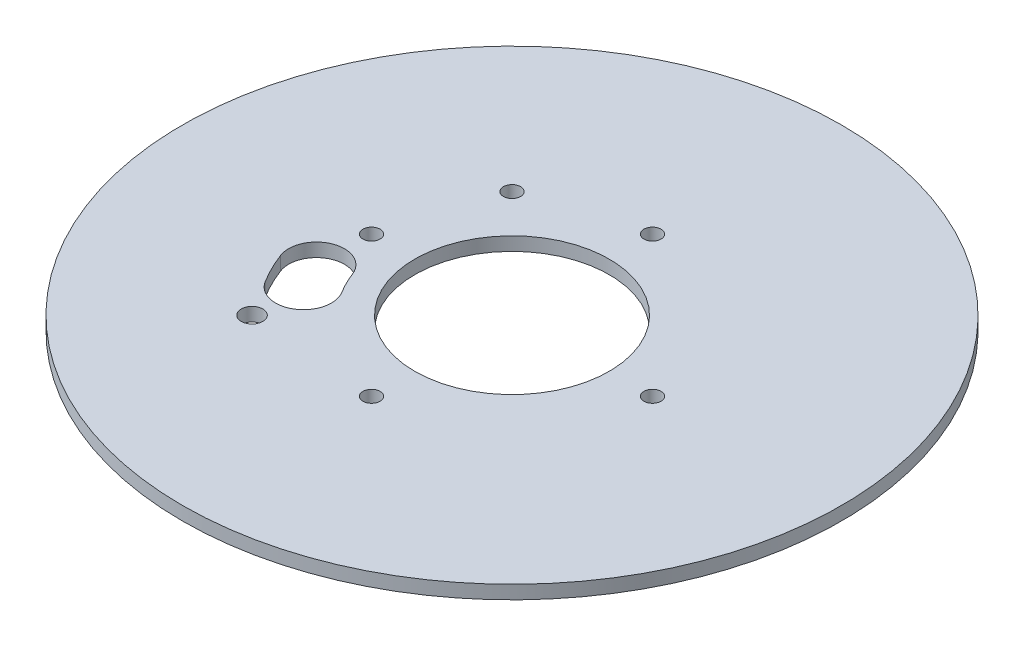
ISO-10303-21;
HEADER;
FILE_DESCRIPTION(('STEP AP214'),'2;1');
FILE_NAME('part.step','',(''),(''),'','','');
FILE_SCHEMA(('AUTOMOTIVE_DESIGN { 1 0 10303 214 1 1 1 1 }'));
ENDSEC;
DATA;
#1=APPLICATION_CONTEXT('core data for automotive mechanical design processes');
#2=APPLICATION_PROTOCOL_DEFINITION('international standard','automotive_design',2000,#1);
#3=PRODUCT_CONTEXT('',#1,'mechanical');
#4=PRODUCT('Part','Part','',(#3));
#5=PRODUCT_RELATED_PRODUCT_CATEGORY('part','',(#4));
#6=PRODUCT_DEFINITION_FORMATION('','',#4);
#7=PRODUCT_DEFINITION_CONTEXT('part definition',#1,'design');
#8=PRODUCT_DEFINITION('design','',#6,#7);
#9=PRODUCT_DEFINITION_SHAPE('','',#8);
#10=(LENGTH_UNIT() NAMED_UNIT(*) SI_UNIT(.MILLI.,.METRE.));
#11=(NAMED_UNIT(*) PLANE_ANGLE_UNIT() SI_UNIT($,.RADIAN.));
#12=(NAMED_UNIT(*) SI_UNIT($,.STERADIAN.) SOLID_ANGLE_UNIT());
#13=UNCERTAINTY_MEASURE_WITH_UNIT(LENGTH_MEASURE(1.E-05),#10,'distance_accuracy_value','');
#14=(GEOMETRIC_REPRESENTATION_CONTEXT(3) GLOBAL_UNCERTAINTY_ASSIGNED_CONTEXT((#13)) GLOBAL_UNIT_ASSIGNED_CONTEXT((#10,
#11,#12)) REPRESENTATION_CONTEXT('',''));
#15=CARTESIAN_POINT('',(0.,0.,0.));
#16=DIRECTION('',(0.,0.,1.));
#17=DIRECTION('',(1.,0.,0.));
#18=AXIS2_PLACEMENT_3D('',#15,#16,#17);
#19=CARTESIAN_POINT('',(0.,3.175,0.));
#20=DIRECTION('',(0.,-1.,0.));
#21=DIRECTION('',(0.,0.,-1.));
#22=AXIS2_PLACEMENT_3D('',#19,#20,#21);
#23=CYLINDRICAL_SURFACE('',#22,77.4600051);
#24=CARTESIAN_POINT('',(0.,3.175,0.));
#25=DIRECTION('',(0.,1.,0.));
#26=DIRECTION('',(0.,0.,1.));
#27=AXIS2_PLACEMENT_3D('',#24,#25,#26);
#28=CIRCLE('',#27,77.4600051);
#29=CARTESIAN_POINT('',(0.,3.175,77.4600051));
#30=VERTEX_POINT('',#29);
#31=EDGE_CURVE('E11',#30,#30,#28,.T.);
#32=ORIENTED_EDGE('',*,*,#31,.F.);
#33=EDGE_LOOP('',(#32));
#34=FACE_BOUND('',#33,.T.);
#35=CARTESIAN_POINT('',(0.,0.,0.));
#36=DIRECTION('',(0.,1.,0.));
#37=DIRECTION('',(0.,0.,1.));
#38=AXIS2_PLACEMENT_3D('',#35,#36,#37);
#39=CIRCLE('',#38,77.4600051);
#40=CARTESIAN_POINT('',(0.,0.,77.4600051));
#41=VERTEX_POINT('',#40);
#42=EDGE_CURVE('E36',#41,#41,#39,.T.);
#43=ORIENTED_EDGE('',*,*,#42,.T.);
#44=EDGE_LOOP('',(#43));
#45=FACE_BOUND('',#44,.T.);
#46=ADVANCED_FACE('F33',(#34,#45),#23,.T.);
#47=CARTESIAN_POINT('',(0.,3.175,0.));
#48=DIRECTION('',(0.,1.,0.));
#49=DIRECTION('',(0.,0.,1.));
#50=AXIS2_PLACEMENT_3D('',#47,#48,#49);
#51=PLANE('',#50);
#52=CARTESIAN_POINT('',(-30.5519464266559,3.175,30.5519464266555));
#53=DIRECTION('',(0.,-1.,0.));
#54=DIRECTION('',(0.,0.,-1.));
#55=AXIS2_PLACEMENT_3D('',#52,#53,#54);
#56=CIRCLE('',#55,2.53999999999999);
#57=CARTESIAN_POINT('',(-30.5519464266559,3.175,28.0119464266556));
#58=VERTEX_POINT('',#57);
#59=EDGE_CURVE('E92',#58,#58,#56,.T.);
#60=ORIENTED_EDGE('',*,*,#59,.T.);
#61=EDGE_LOOP('',(#60));
#62=FACE_BOUND('',#61,.T.);
#63=CARTESIAN_POINT('',(-33.242514605961,3.175,12.7030765646133));
#64=DIRECTION('',(0.,1.,0.));
#65=DIRECTION('',(0.,0.,1.));
#66=AXIS2_PLACEMENT_3D('',#63,#64,#65);
#67=CIRCLE('',#66,6.55197639919967);
#68=CARTESIAN_POINT('',(-27.1221810022313,3.175,10.3642924115272));
#69=VERTEX_POINT('',#68);
#70=CARTESIAN_POINT('',(-39.3628482096907,3.175,15.0418607176993));
#71=VERTEX_POINT('',#70);
#72=EDGE_CURVE('E79',#69,#71,#67,.T.);
#73=ORIENTED_EDGE('',*,*,#72,.F.);
#74=CARTESIAN_POINT('',(0.,3.175,0.));
#75=DIRECTION('',(0.,1.,0.));
#76=DIRECTION('',(0.,0.,1.));
#77=AXIS2_PLACEMENT_3D('',#74,#75,#76);
#78=CIRCLE('',#77,29.0350005942731);
#79=CARTESIAN_POINT('',(-24.6777747972826,3.175,15.2983231291551));
#80=VERTEX_POINT('',#79);
#81=EDGE_CURVE('E111',#80,#69,#78,.F.);
#82=ORIENTED_EDGE('',*,*,#81,.F.);
#83=CARTESIAN_POINT('',(-30.2465089025766,3.175,18.7505101461351));
#84=DIRECTION('',(0.,1.,0.));
#85=DIRECTION('',(0.,0.,1.));
#86=AXIS2_PLACEMENT_3D('',#83,#84,#85);
#87=CIRCLE('',#86,6.55197639919968);
#88=CARTESIAN_POINT('',(-35.8152430078706,3.175,22.202697163115));
#89=VERTEX_POINT('',#88);
#90=EDGE_CURVE('E109',#89,#80,#87,.T.);
#91=ORIENTED_EDGE('',*,*,#90,.F.);
#92=CARTESIAN_POINT('',(0.,3.175,0.));
#93=DIRECTION('',(0.,1.,0.));
#94=DIRECTION('',(0.,0.,1.));
#95=AXIS2_PLACEMENT_3D('',#92,#93,#94);
#96=CIRCLE('',#95,42.1389533926724);
#97=EDGE_CURVE('E103',#71,#89,#96,.T.);
#98=ORIENTED_EDGE('',*,*,#97,.F.);
#99=EDGE_LOOP('',(#73,#82,#91,#98));
#100=FACE_BOUND('',#99,.T.);
#101=CARTESIAN_POINT('',(-25.1637927540144,3.175,-25.1637927540141));
#102=DIRECTION('',(0.,1.,0.));
#103=DIRECTION('',(0.,0.,1.));
#104=AXIS2_PLACEMENT_3D('',#101,#102,#103);
#105=CIRCLE('',#104,2.0193);
#106=CARTESIAN_POINT('',(-25.1637927540144,3.175,-23.1444927540141));
#107=VERTEX_POINT('',#106);
#108=EDGE_CURVE('E117',#107,#107,#105,.T.);
#109=ORIENTED_EDGE('',*,*,#108,.F.);
#110=EDGE_LOOP('',(#109));
#111=FACE_BOUND('',#110,.T.);
#112=CARTESIAN_POINT('',(-33.0199999999991,3.175,5.68989300120393E-13));
#113=DIRECTION('',(0.,1.,0.));
#114=DIRECTION('',(0.,0.,1.));
#115=AXIS2_PLACEMENT_3D('',#112,#113,#114);
#116=CIRCLE('',#115,2.0193);
#117=CARTESIAN_POINT('',(-33.0199999999991,3.175,2.01930000000057));
#118=VERTEX_POINT('',#117);
#119=EDGE_CURVE('E123',#118,#118,#116,.T.);
#120=ORIENTED_EDGE('',*,*,#119,.F.);
#121=EDGE_LOOP('',(#120));
#122=FACE_BOUND('',#121,.T.);
#123=CARTESIAN_POINT('',(1.63757896132211E-12,3.175,33.02));
#124=DIRECTION('',(0.,1.,0.));
#125=DIRECTION('',(0.,0.,1.));
#126=AXIS2_PLACEMENT_3D('',#123,#124,#125);
#127=CIRCLE('',#126,2.0193);
#128=CARTESIAN_POINT('',(1.63757896132211E-12,3.175,35.0393));
#129=VERTEX_POINT('',#128);
#130=EDGE_CURVE('E129',#129,#129,#127,.T.);
#131=ORIENTED_EDGE('',*,*,#130,.F.);
#132=EDGE_LOOP('',(#131));
#133=FACE_BOUND('',#132,.T.);
#134=CARTESIAN_POINT('',(33.0200000000009,3.175,-8.32667268468867E-13));
#135=DIRECTION('',(0.,1.,0.));
#136=DIRECTION('',(0.,0.,1.));
#137=AXIS2_PLACEMENT_3D('',#134,#135,#136);
#138=CIRCLE('',#137,2.01930000000001);
#139=CARTESIAN_POINT('',(33.0200000000009,3.175,2.01929999999917));
#140=VERTEX_POINT('',#139);
#141=EDGE_CURVE('E135',#140,#140,#138,.T.);
#142=ORIENTED_EDGE('',*,*,#141,.F.);
#143=EDGE_LOOP('',(#142));
#144=FACE_BOUND('',#143,.T.);
#145=CARTESIAN_POINT('',(0.,3.175,-33.02));
#146=DIRECTION('',(0.,1.,0.));
#147=DIRECTION('',(0.,0.,1.));
#148=AXIS2_PLACEMENT_3D('',#145,#146,#147);
#149=CIRCLE('',#148,2.01930000000001);
#150=CARTESIAN_POINT('',(0.,3.175,-31.0007));
#151=VERTEX_POINT('',#150);
#152=EDGE_CURVE('E141',#151,#151,#149,.T.);
#153=ORIENTED_EDGE('',*,*,#152,.F.);
#154=EDGE_LOOP('',(#153));
#155=FACE_BOUND('',#154,.T.);
#156=CARTESIAN_POINT('',(0.,3.175,0.));
#157=DIRECTION('',(0.,1.,0.));
#158=DIRECTION('',(0.,0.,1.));
#159=AXIS2_PLACEMENT_3D('',#156,#157,#158);
#160=CIRCLE('',#159,22.86);
#161=CARTESIAN_POINT('',(0.,3.175,22.86));
#162=VERTEX_POINT('',#161);
#163=EDGE_CURVE('E147',#162,#162,#160,.T.);
#164=ORIENTED_EDGE('',*,*,#163,.F.);
#165=EDGE_LOOP('',(#164));
#166=FACE_BOUND('',#165,.T.);
#167=ORIENTED_EDGE('',*,*,#31,.T.);
#168=EDGE_LOOP('',(#167));
#169=FACE_BOUND('',#168,.T.);
#170=ADVANCED_FACE('F157',(#62,#100,#111,#122,#133,#144,#155,#166,#169),#51,.T.);
#171=CARTESIAN_POINT('',(0.,0.,0.));
#172=DIRECTION('',(0.,1.,0.));
#173=DIRECTION('',(0.,0.,1.));
#174=AXIS2_PLACEMENT_3D('',#171,#172,#173);
#175=PLANE('',#174);
#176=CARTESIAN_POINT('',(-30.5519464266559,0.,30.5519464266555));
#177=DIRECTION('',(0.,-1.,0.));
#178=DIRECTION('',(0.,0.,-1.));
#179=AXIS2_PLACEMENT_3D('',#176,#177,#178);
#180=CIRCLE('',#179,2.53999999999999);
#181=CARTESIAN_POINT('',(-30.5519464266559,0.,28.0119464266556));
#182=VERTEX_POINT('',#181);
#183=EDGE_CURVE('E95',#182,#182,#180,.T.);
#184=ORIENTED_EDGE('',*,*,#183,.F.);
#185=EDGE_LOOP('',(#184));
#186=FACE_BOUND('',#185,.T.);
#187=CARTESIAN_POINT('',(0.,0.,0.));
#188=DIRECTION('',(0.,-1.,0.));
#189=DIRECTION('',(0.,0.,1.));
#190=AXIS2_PLACEMENT_3D('',#187,#188,#189);
#191=CIRCLE('',#190,29.0350005942731);
#192=CARTESIAN_POINT('',(-24.6777747972826,0.,15.2983231291551));
#193=VERTEX_POINT('',#192);
#194=CARTESIAN_POINT('',(-27.1221810022313,0.,10.3642924115272));
#195=VERTEX_POINT('',#194);
#196=EDGE_CURVE('E82',#193,#195,#191,.T.);
#197=ORIENTED_EDGE('',*,*,#196,.T.);
#198=CARTESIAN_POINT('',(-33.242514605961,0.,12.7030765646133));
#199=DIRECTION('',(0.,1.,0.));
#200=DIRECTION('',(0.,0.,1.));
#201=AXIS2_PLACEMENT_3D('',#198,#199,#200);
#202=CIRCLE('',#201,6.55197639919967);
#203=CARTESIAN_POINT('',(-39.3628482096907,0.,15.0418607176993));
#204=VERTEX_POINT('',#203);
#205=EDGE_CURVE('E76',#195,#204,#202,.T.);
#206=ORIENTED_EDGE('',*,*,#205,.T.);
#207=CARTESIAN_POINT('',(0.,0.,0.));
#208=DIRECTION('',(0.,1.,0.));
#209=DIRECTION('',(0.,0.,1.));
#210=AXIS2_PLACEMENT_3D('',#207,#208,#209);
#211=CIRCLE('',#210,42.1389533926724);
#212=CARTESIAN_POINT('',(-35.8152430078706,0.,22.202697163115));
#213=VERTEX_POINT('',#212);
#214=EDGE_CURVE('E85',#204,#213,#211,.T.);
#215=ORIENTED_EDGE('',*,*,#214,.T.);
#216=CARTESIAN_POINT('',(-30.2465089025766,0.,18.7505101461351));
#217=DIRECTION('',(0.,1.,0.));
#218=DIRECTION('',(0.,0.,1.));
#219=AXIS2_PLACEMENT_3D('',#216,#217,#218);
#220=CIRCLE('',#219,6.55197639919968);
#221=EDGE_CURVE('E55',#213,#193,#220,.T.);
#222=ORIENTED_EDGE('',*,*,#221,.T.);
#223=EDGE_LOOP('',(#197,#206,#215,#222));
#224=FACE_BOUND('',#223,.T.);
#225=CARTESIAN_POINT('',(-25.1637927540144,0.,-25.1637927540141));
#226=DIRECTION('',(0.,1.,0.));
#227=DIRECTION('',(0.,0.,1.));
#228=AXIS2_PLACEMENT_3D('',#225,#226,#227);
#229=CIRCLE('',#228,2.0193);
#230=CARTESIAN_POINT('',(-25.1637927540144,0.,-23.1444927540141));
#231=VERTEX_POINT('',#230);
#232=EDGE_CURVE('E114',#231,#231,#229,.T.);
#233=ORIENTED_EDGE('',*,*,#232,.T.);
#234=EDGE_LOOP('',(#233));
#235=FACE_BOUND('',#234,.T.);
#236=CARTESIAN_POINT('',(-33.0199999999991,0.,5.68989300120393E-13));
#237=DIRECTION('',(0.,1.,0.));
#238=DIRECTION('',(0.,0.,1.));
#239=AXIS2_PLACEMENT_3D('',#236,#237,#238);
#240=CIRCLE('',#239,2.0193);
#241=CARTESIAN_POINT('',(-33.0199999999991,0.,2.01930000000057));
#242=VERTEX_POINT('',#241);
#243=EDGE_CURVE('E120',#242,#242,#240,.T.);
#244=ORIENTED_EDGE('',*,*,#243,.T.);
#245=EDGE_LOOP('',(#244));
#246=FACE_BOUND('',#245,.T.);
#247=CARTESIAN_POINT('',(1.63757896132211E-12,0.,33.02));
#248=DIRECTION('',(0.,1.,0.));
#249=DIRECTION('',(0.,0.,1.));
#250=AXIS2_PLACEMENT_3D('',#247,#248,#249);
#251=CIRCLE('',#250,2.0193);
#252=CARTESIAN_POINT('',(1.63757896132211E-12,0.,35.0393));
#253=VERTEX_POINT('',#252);
#254=EDGE_CURVE('E126',#253,#253,#251,.T.);
#255=ORIENTED_EDGE('',*,*,#254,.T.);
#256=EDGE_LOOP('',(#255));
#257=FACE_BOUND('',#256,.T.);
#258=CARTESIAN_POINT('',(33.0200000000009,0.,-8.32667268468867E-13));
#259=DIRECTION('',(0.,1.,0.));
#260=DIRECTION('',(0.,0.,1.));
#261=AXIS2_PLACEMENT_3D('',#258,#259,#260);
#262=CIRCLE('',#261,2.01930000000001);
#263=CARTESIAN_POINT('',(33.0200000000009,0.,2.01929999999917));
#264=VERTEX_POINT('',#263);
#265=EDGE_CURVE('E132',#264,#264,#262,.T.);
#266=ORIENTED_EDGE('',*,*,#265,.T.);
#267=EDGE_LOOP('',(#266));
#268=FACE_BOUND('',#267,.T.);
#269=CARTESIAN_POINT('',(0.,0.,-33.02));
#270=DIRECTION('',(0.,1.,0.));
#271=DIRECTION('',(0.,0.,1.));
#272=AXIS2_PLACEMENT_3D('',#269,#270,#271);
#273=CIRCLE('',#272,2.01930000000001);
#274=CARTESIAN_POINT('',(0.,0.,-31.0007));
#275=VERTEX_POINT('',#274);
#276=EDGE_CURVE('E138',#275,#275,#273,.T.);
#277=ORIENTED_EDGE('',*,*,#276,.T.);
#278=EDGE_LOOP('',(#277));
#279=FACE_BOUND('',#278,.T.);
#280=CARTESIAN_POINT('',(0.,0.,0.));
#281=DIRECTION('',(0.,1.,0.));
#282=DIRECTION('',(0.,0.,1.));
#283=AXIS2_PLACEMENT_3D('',#280,#281,#282);
#284=CIRCLE('',#283,22.86);
#285=CARTESIAN_POINT('',(0.,0.,22.86));
#286=VERTEX_POINT('',#285);
#287=EDGE_CURVE('E144',#286,#286,#284,.T.);
#288=ORIENTED_EDGE('',*,*,#287,.T.);
#289=EDGE_LOOP('',(#288));
#290=FACE_BOUND('',#289,.T.);
#291=ORIENTED_EDGE('',*,*,#42,.F.);
#292=EDGE_LOOP('',(#291));
#293=FACE_BOUND('',#292,.T.);
#294=ADVANCED_FACE('F89',(#186,#224,#235,#246,#257,#268,#279,#290,#293),#175,.F.);
#295=CARTESIAN_POINT('',(0.,0.,0.));
#296=DIRECTION('',(0.,1.,0.));
#297=DIRECTION('',(0.,0.,1.));
#298=AXIS2_PLACEMENT_3D('',#295,#296,#297);
#299=CYLINDRICAL_SURFACE('',#298,22.86);
#300=ORIENTED_EDGE('',*,*,#163,.T.);
#301=EDGE_LOOP('',(#300));
#302=FACE_BOUND('',#301,.T.);
#303=ORIENTED_EDGE('',*,*,#287,.F.);
#304=EDGE_LOOP('',(#303));
#305=FACE_BOUND('',#304,.T.);
#306=ADVANCED_FACE('F156',(#302,#305),#299,.F.);
#307=CARTESIAN_POINT('',(0.,0.,-33.02));
#308=DIRECTION('',(0.,1.,0.));
#309=DIRECTION('',(0.,0.,1.));
#310=AXIS2_PLACEMENT_3D('',#307,#308,#309);
#311=CYLINDRICAL_SURFACE('',#310,2.01930000000001);
#312=ORIENTED_EDGE('',*,*,#152,.T.);
#313=EDGE_LOOP('',(#312));
#314=FACE_BOUND('',#313,.T.);
#315=ORIENTED_EDGE('',*,*,#276,.F.);
#316=EDGE_LOOP('',(#315));
#317=FACE_BOUND('',#316,.T.);
#318=ADVANCED_FACE('F164',(#314,#317),#311,.F.);
#319=CARTESIAN_POINT('',(33.0200000000009,0.,-8.32667268468867E-13));
#320=DIRECTION('',(0.,1.,0.));
#321=DIRECTION('',(0.,0.,1.));
#322=AXIS2_PLACEMENT_3D('',#319,#320,#321);
#323=CYLINDRICAL_SURFACE('',#322,2.01930000000001);
#324=ORIENTED_EDGE('',*,*,#141,.T.);
#325=EDGE_LOOP('',(#324));
#326=FACE_BOUND('',#325,.T.);
#327=ORIENTED_EDGE('',*,*,#265,.F.);
#328=EDGE_LOOP('',(#327));
#329=FACE_BOUND('',#328,.T.);
#330=ADVANCED_FACE('F196',(#326,#329),#323,.F.);
#331=CARTESIAN_POINT('',(1.63757896132211E-12,0.,33.02));
#332=DIRECTION('',(0.,1.,0.));
#333=DIRECTION('',(0.,0.,1.));
#334=AXIS2_PLACEMENT_3D('',#331,#332,#333);
#335=CYLINDRICAL_SURFACE('',#334,2.0193);
#336=ORIENTED_EDGE('',*,*,#130,.T.);
#337=EDGE_LOOP('',(#336));
#338=FACE_BOUND('',#337,.T.);
#339=ORIENTED_EDGE('',*,*,#254,.F.);
#340=EDGE_LOOP('',(#339));
#341=FACE_BOUND('',#340,.T.);
#342=ADVANCED_FACE('F204',(#338,#341),#335,.F.);
#343=CARTESIAN_POINT('',(-33.0199999999991,0.,5.68989300120393E-13));
#344=DIRECTION('',(0.,1.,0.));
#345=DIRECTION('',(0.,0.,1.));
#346=AXIS2_PLACEMENT_3D('',#343,#344,#345);
#347=CYLINDRICAL_SURFACE('',#346,2.0193);
#348=ORIENTED_EDGE('',*,*,#119,.T.);
#349=EDGE_LOOP('',(#348));
#350=FACE_BOUND('',#349,.T.);
#351=ORIENTED_EDGE('',*,*,#243,.F.);
#352=EDGE_LOOP('',(#351));
#353=FACE_BOUND('',#352,.T.);
#354=ADVANCED_FACE('F212',(#350,#353),#347,.F.);
#355=CARTESIAN_POINT('',(-25.1637927540144,0.,-25.1637927540141));
#356=DIRECTION('',(0.,1.,0.));
#357=DIRECTION('',(0.,0.,1.));
#358=AXIS2_PLACEMENT_3D('',#355,#356,#357);
#359=CYLINDRICAL_SURFACE('',#358,2.0193);
#360=ORIENTED_EDGE('',*,*,#108,.T.);
#361=EDGE_LOOP('',(#360));
#362=FACE_BOUND('',#361,.T.);
#363=ORIENTED_EDGE('',*,*,#232,.F.);
#364=EDGE_LOOP('',(#363));
#365=FACE_BOUND('',#364,.T.);
#366=ADVANCED_FACE('F220',(#362,#365),#359,.F.);
#367=CARTESIAN_POINT('',(-33.242514605961,0.,12.7030765646133));
#368=DIRECTION('',(0.,1.,0.));
#369=DIRECTION('',(0.,0.,1.));
#370=AXIS2_PLACEMENT_3D('',#367,#368,#369);
#371=CYLINDRICAL_SURFACE('',#370,6.55197639919967);
#372=ORIENTED_EDGE('',*,*,#72,.T.);
#373=DIRECTION('',(0.,1.,0.));
#374=VECTOR('',#373,1.);
#375=CARTESIAN_POINT('',(-39.3628482096907,0.,15.0418607176993));
#376=LINE('',#375,#374);
#377=EDGE_CURVE('E47',#204,#71,#376,.T.);
#378=ORIENTED_EDGE('',*,*,#377,.F.);
#379=ORIENTED_EDGE('',*,*,#205,.F.);
#380=DIRECTION('',(0.,1.,0.));
#381=VECTOR('',#380,1.);
#382=CARTESIAN_POINT('',(-27.1221810022313,0.,10.3642924115272));
#383=LINE('',#382,#381);
#384=EDGE_CURVE('E101',#195,#69,#383,.T.);
#385=ORIENTED_EDGE('',*,*,#384,.T.);
#386=EDGE_LOOP('',(#372,#378,#379,#385));
#387=FACE_BOUND('',#386,.T.);
#388=ADVANCED_FACE('F73',(#387),#371,.F.);
#389=CARTESIAN_POINT('',(0.,0.,0.));
#390=DIRECTION('',(0.,1.,0.));
#391=DIRECTION('',(0.,0.,1.));
#392=AXIS2_PLACEMENT_3D('',#389,#390,#391);
#393=CYLINDRICAL_SURFACE('',#392,29.0350005942731);
#394=ORIENTED_EDGE('',*,*,#81,.T.);
#395=ORIENTED_EDGE('',*,*,#384,.F.);
#396=ORIENTED_EDGE('',*,*,#196,.F.);
#397=DIRECTION('',(0.,1.,0.));
#398=VECTOR('',#397,1.);
#399=CARTESIAN_POINT('',(-24.6777747972826,0.,15.2983231291551));
#400=LINE('',#399,#398);
#401=EDGE_CURVE('E104',#193,#80,#400,.T.);
#402=ORIENTED_EDGE('',*,*,#401,.T.);
#403=EDGE_LOOP('',(#394,#395,#396,#402));
#404=FACE_BOUND('',#403,.T.);
#405=ADVANCED_FACE('F235',(#404),#393,.T.);
#406=CARTESIAN_POINT('',(-30.2465089025766,0.,18.7505101461351));
#407=DIRECTION('',(0.,1.,0.));
#408=DIRECTION('',(0.,0.,1.));
#409=AXIS2_PLACEMENT_3D('',#406,#407,#408);
#410=CYLINDRICAL_SURFACE('',#409,6.55197639919968);
#411=ORIENTED_EDGE('',*,*,#90,.T.);
#412=ORIENTED_EDGE('',*,*,#401,.F.);
#413=ORIENTED_EDGE('',*,*,#221,.F.);
#414=DIRECTION('',(0.,1.,0.));
#415=VECTOR('',#414,1.);
#416=CARTESIAN_POINT('',(-35.8152430078706,0.,22.202697163115));
#417=LINE('',#416,#415);
#418=EDGE_CURVE('E81',#213,#89,#417,.T.);
#419=ORIENTED_EDGE('',*,*,#418,.T.);
#420=EDGE_LOOP('',(#411,#412,#413,#419));
#421=FACE_BOUND('',#420,.T.);
#422=ADVANCED_FACE('F242',(#421),#410,.F.);
#423=CARTESIAN_POINT('',(0.,0.,0.));
#424=DIRECTION('',(0.,1.,0.));
#425=DIRECTION('',(0.,0.,1.));
#426=AXIS2_PLACEMENT_3D('',#423,#424,#425);
#427=CYLINDRICAL_SURFACE('',#426,42.1389533926724);
#428=ORIENTED_EDGE('',*,*,#97,.T.);
#429=ORIENTED_EDGE('',*,*,#418,.F.);
#430=ORIENTED_EDGE('',*,*,#214,.F.);
#431=ORIENTED_EDGE('',*,*,#377,.T.);
#432=EDGE_LOOP('',(#428,#429,#430,#431));
#433=FACE_BOUND('',#432,.T.);
#434=ADVANCED_FACE('F86',(#433),#427,.F.);
#435=CARTESIAN_POINT('',(-30.5519464266559,3.175,30.5519464266555));
#436=DIRECTION('',(0.,-1.,0.));
#437=DIRECTION('',(0.,0.,-1.));
#438=AXIS2_PLACEMENT_3D('',#435,#436,#437);
#439=CYLINDRICAL_SURFACE('',#438,2.53999999999999);
#440=ORIENTED_EDGE('',*,*,#59,.F.);
#441=EDGE_LOOP('',(#440));
#442=FACE_BOUND('',#441,.T.);
#443=ORIENTED_EDGE('',*,*,#183,.T.);
#444=EDGE_LOOP('',(#443));
#445=FACE_BOUND('',#444,.T.);
#446=ADVANCED_FACE('F255',(#442,#445),#439,.F.);
#447=CLOSED_SHELL('',(#46,#170,#294,#306,#318,#330,#342,#354,#366,#388,#405,#422,#434,#446));
#448=MANIFOLD_SOLID_BREP('B2',#447);
#449=ADVANCED_BREP_SHAPE_REPRESENTATION('',(#18,#448),#14);
#450=SHAPE_DEFINITION_REPRESENTATION(#9,#449);
ENDSEC;
END-ISO-10303-21;
